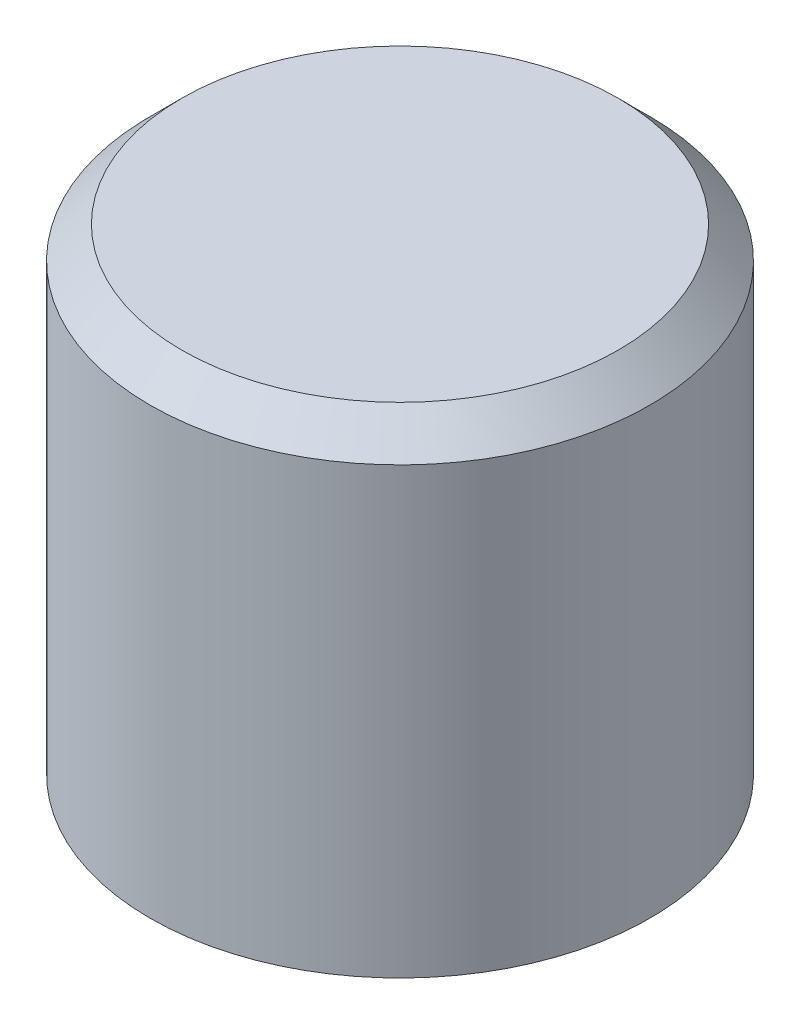
ISO-10303-21;
HEADER;
FILE_DESCRIPTION(('STEP AP214'),'2;1');
FILE_NAME('part.step','',(''),(''),'','','');
FILE_SCHEMA(('AUTOMOTIVE_DESIGN { 1 0 10303 214 1 1 1 1 }'));
ENDSEC;
DATA;
#1=APPLICATION_CONTEXT('core data for automotive mechanical design processes');
#2=APPLICATION_PROTOCOL_DEFINITION('international standard','automotive_design',2000,#1);
#3=PRODUCT_CONTEXT('',#1,'mechanical');
#4=PRODUCT('Part','Part','',(#3));
#5=PRODUCT_RELATED_PRODUCT_CATEGORY('part','',(#4));
#6=PRODUCT_DEFINITION_FORMATION('','',#4);
#7=PRODUCT_DEFINITION_CONTEXT('part definition',#1,'design');
#8=PRODUCT_DEFINITION('design','',#6,#7);
#9=PRODUCT_DEFINITION_SHAPE('','',#8);
#10=(LENGTH_UNIT() NAMED_UNIT(*) SI_UNIT(.MILLI.,.METRE.));
#11=(NAMED_UNIT(*) PLANE_ANGLE_UNIT() SI_UNIT($,.RADIAN.));
#12=(NAMED_UNIT(*) SI_UNIT($,.STERADIAN.) SOLID_ANGLE_UNIT());
#13=UNCERTAINTY_MEASURE_WITH_UNIT(LENGTH_MEASURE(1.E-05),#10,'distance_accuracy_value','');
#14=(GEOMETRIC_REPRESENTATION_CONTEXT(3) GLOBAL_UNCERTAINTY_ASSIGNED_CONTEXT((#13)) GLOBAL_UNIT_ASSIGNED_CONTEXT((#10,
#11,#12)) REPRESENTATION_CONTEXT('',''));
#15=CARTESIAN_POINT('',(0.,0.,0.));
#16=DIRECTION('',(0.,0.,1.));
#17=DIRECTION('',(1.,0.,0.));
#18=AXIS2_PLACEMENT_3D('',#15,#16,#17);
#19=CARTESIAN_POINT('',(0.,15.,0.));
#20=DIRECTION('',(0.,-1.,0.));
#21=DIRECTION('',(0.,0.,-1.));
#22=AXIS2_PLACEMENT_3D('',#19,#20,#21);
#23=CYLINDRICAL_SURFACE('',#22,7.875);
#24=CARTESIAN_POINT('',(0.,14.,0.));
#25=DIRECTION('',(0.,1.,0.));
#26=DIRECTION('',(0.,0.,1.));
#27=AXIS2_PLACEMENT_3D('',#24,#25,#26);
#28=CIRCLE('',#27,7.875);
#29=CARTESIAN_POINT('',(0.,14.,7.875));
#30=VERTEX_POINT('',#29);
#31=EDGE_CURVE('E10',#30,#30,#28,.F.);
#32=ORIENTED_EDGE('',*,*,#31,.T.);
#33=EDGE_LOOP('',(#32));
#34=FACE_BOUND('',#33,.T.);
#35=CARTESIAN_POINT('',(0.,0.,0.));
#36=DIRECTION('',(0.,1.,0.));
#37=DIRECTION('',(0.,0.,1.));
#38=AXIS2_PLACEMENT_3D('',#35,#36,#37);
#39=CIRCLE('',#38,7.875);
#40=CARTESIAN_POINT('',(0.,0.,7.875));
#41=VERTEX_POINT('',#40);
#42=EDGE_CURVE('E43',#41,#41,#39,.T.);
#43=ORIENTED_EDGE('',*,*,#42,.T.);
#44=EDGE_LOOP('',(#43));
#45=FACE_BOUND('',#44,.T.);
#46=ADVANCED_FACE('F32',(#34,#45),#23,.T.);
#47=CARTESIAN_POINT('',(0.,15.,0.));
#48=DIRECTION('',(0.,1.,0.));
#49=DIRECTION('',(0.,0.,1.));
#50=AXIS2_PLACEMENT_3D('',#47,#48,#49);
#51=PLANE('',#50);
#52=CARTESIAN_POINT('',(0.,15.,0.));
#53=DIRECTION('',(0.,1.,0.));
#54=DIRECTION('',(0.,0.,1.));
#55=AXIS2_PLACEMENT_3D('',#52,#53,#54);
#56=CIRCLE('',#55,6.87499999999999);
#57=CARTESIAN_POINT('',(0.,15.,6.87499999999999));
#58=VERTEX_POINT('',#57);
#59=EDGE_CURVE('E39',#58,#58,#56,.T.);
#60=ORIENTED_EDGE('',*,*,#59,.T.);
#61=EDGE_LOOP('',(#60));
#62=FACE_BOUND('',#61,.T.);
#63=ADVANCED_FACE('F53',(#62),#51,.T.);
#64=CARTESIAN_POINT('',(0.,0.,0.));
#65=DIRECTION('',(0.,1.,0.));
#66=DIRECTION('',(0.,0.,1.));
#67=AXIS2_PLACEMENT_3D('',#64,#65,#66);
#68=PLANE('',#67);
#69=ORIENTED_EDGE('',*,*,#42,.F.);
#70=EDGE_LOOP('',(#69));
#71=FACE_BOUND('',#70,.T.);
#72=ADVANCED_FACE('F51',(#71),#68,.F.);
#73=CARTESIAN_POINT('',(0.,15.,0.));
#74=DIRECTION('',(0.,-1.,0.));
#75=DIRECTION('',(0.,0.,-1.));
#76=AXIS2_PLACEMENT_3D('',#73,#74,#75);
#77=CONICAL_SURFACE('',#76,6.87499999999999,0.785398163397447);
#78=ORIENTED_EDGE('',*,*,#31,.F.);
#79=EDGE_LOOP('',(#78));
#80=FACE_BOUND('',#79,.T.);
#81=ORIENTED_EDGE('',*,*,#59,.F.);
#82=EDGE_LOOP('',(#81));
#83=FACE_BOUND('',#82,.T.);
#84=ADVANCED_FACE('F34',(#80,#83),#77,.T.);
#85=CLOSED_SHELL('',(#46,#63,#72,#84));
#86=MANIFOLD_SOLID_BREP('B2',#85);
#87=ADVANCED_BREP_SHAPE_REPRESENTATION('',(#18,#86),#14);
#88=SHAPE_DEFINITION_REPRESENTATION(#9,#87);
ENDSEC;
END-ISO-10303-21;
